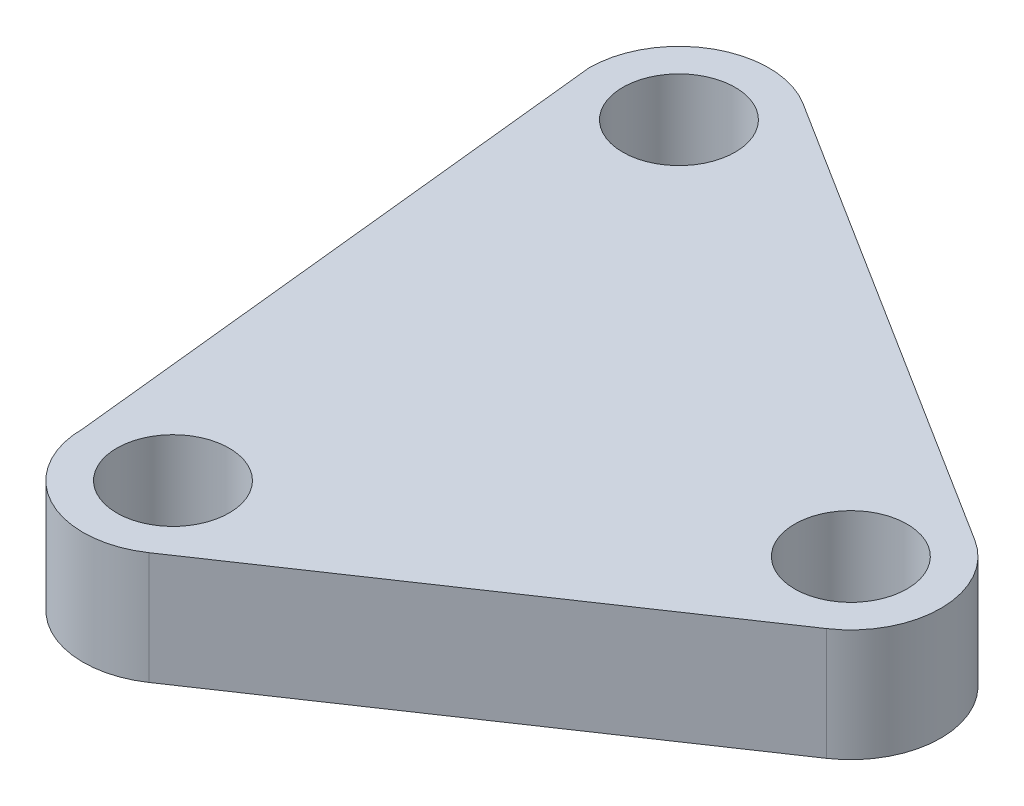
ISO-10303-21;
HEADER;
FILE_DESCRIPTION(('STEP AP214'),'2;1');
FILE_NAME('part.step','',(''),(''),'','','');
FILE_SCHEMA(('AUTOMOTIVE_DESIGN { 1 0 10303 214 1 1 1 1 }'));
ENDSEC;
DATA;
#1=APPLICATION_CONTEXT('core data for automotive mechanical design processes');
#2=APPLICATION_PROTOCOL_DEFINITION('international standard','automotive_design',2000,#1);
#3=PRODUCT_CONTEXT('',#1,'mechanical');
#4=PRODUCT('Part','Part','',(#3));
#5=PRODUCT_RELATED_PRODUCT_CATEGORY('part','',(#4));
#6=PRODUCT_DEFINITION_FORMATION('','',#4);
#7=PRODUCT_DEFINITION_CONTEXT('part definition',#1,'design');
#8=PRODUCT_DEFINITION('design','',#6,#7);
#9=PRODUCT_DEFINITION_SHAPE('','',#8);
#10=(LENGTH_UNIT() NAMED_UNIT(*) SI_UNIT(.MILLI.,.METRE.));
#11=(NAMED_UNIT(*) PLANE_ANGLE_UNIT() SI_UNIT($,.RADIAN.));
#12=(NAMED_UNIT(*) SI_UNIT($,.STERADIAN.) SOLID_ANGLE_UNIT());
#13=UNCERTAINTY_MEASURE_WITH_UNIT(LENGTH_MEASURE(1.E-05),#10,'distance_accuracy_value','');
#14=(GEOMETRIC_REPRESENTATION_CONTEXT(3) GLOBAL_UNCERTAINTY_ASSIGNED_CONTEXT((#13)) GLOBAL_UNIT_ASSIGNED_CONTEXT((#10,
#11,#12)) REPRESENTATION_CONTEXT('',''));
#15=CARTESIAN_POINT('',(0.,0.,0.));
#16=DIRECTION('',(0.,0.,1.));
#17=DIRECTION('',(1.,0.,0.));
#18=AXIS2_PLACEMENT_3D('',#15,#16,#17);
#19=CARTESIAN_POINT('',(14.7285274225901,5.,21.8200406260849));
#20=DIRECTION('',(0.559472855000614,0.,0.828848674075951));
#21=DIRECTION('',(0.828848674075951,0.,-0.559472855000614));
#22=AXIS2_PLACEMENT_3D('',#19,#20,#21);
#23=PLANE('',#22);
#24=DIRECTION('',(-0.828848674075951,0.,0.559472855000614));
#25=VECTOR('',#24,1.);
#26=CARTESIAN_POINT('',(14.7285274225901,0.,21.8200406260849));
#27=LINE('',#26,#25);
#28=CARTESIAN_POINT('',(22.8835584296746,0.,16.3153946963093));
#29=VERTEX_POINT('',#28);
#30=CARTESIAN_POINT('',(4.88355842966658,0.,28.4653946963005));
#31=VERTEX_POINT('',#30);
#32=EDGE_CURVE('E131',#29,#31,#27,.T.);
#33=ORIENTED_EDGE('',*,*,#32,.F.);
#34=DIRECTION('',(0.,-1.,0.));
#35=VECTOR('',#34,1.);
#36=CARTESIAN_POINT('',(22.8835584296746,5.,16.3153946963093));
#37=LINE('',#36,#35);
#38=CARTESIAN_POINT('',(22.8835584296746,5.,16.3153946963093));
#39=VERTEX_POINT('',#38);
#40=EDGE_CURVE('E11',#39,#29,#37,.T.);
#41=ORIENTED_EDGE('',*,*,#40,.F.);
#42=DIRECTION('',(-0.828848674075951,0.,0.559472855000614));
#43=VECTOR('',#42,1.);
#44=CARTESIAN_POINT('',(14.7285274225901,5.,21.8200406260849));
#45=LINE('',#44,#43);
#46=CARTESIAN_POINT('',(4.88355842966658,5.,28.4653946963005));
#47=VERTEX_POINT('',#46);
#48=EDGE_CURVE('E153',#39,#47,#45,.T.);
#49=ORIENTED_EDGE('',*,*,#48,.T.);
#50=DIRECTION('',(0.,-1.,0.));
#51=VECTOR('',#50,1.);
#52=CARTESIAN_POINT('',(4.88355842966658,5.,28.4653946963005));
#53=LINE('',#52,#51);
#54=EDGE_CURVE('E86',#47,#31,#53,.T.);
#55=ORIENTED_EDGE('',*,*,#54,.T.);
#56=EDGE_LOOP('',(#33,#41,#49,#55));
#57=FACE_BOUND('',#56,.T.);
#58=ADVANCED_FACE('F41',(#57),#23,.T.);
#59=CARTESIAN_POINT('',(20.6456670096721,5.,13.0000000000055));
#60=DIRECTION('',(0.,-1.,0.));
#61=DIRECTION('',(0.,0.,-1.));
#62=AXIS2_PLACEMENT_3D('',#59,#60,#61);
#63=CYLINDRICAL_SURFACE('',#62,4.);
#64=CARTESIAN_POINT('',(20.6456670096721,0.,13.0000000000055));
#65=DIRECTION('',(0.,1.,0.));
#66=DIRECTION('',(0.,0.,1.));
#67=AXIS2_PLACEMENT_3D('',#64,#65,#66);
#68=CIRCLE('',#67,4.);
#69=CARTESIAN_POINT('',(22.7770229740054,0.,9.61513342164509));
#70=VERTEX_POINT('',#69);
#71=EDGE_CURVE('E134',#29,#70,#68,.T.);
#72=ORIENTED_EDGE('',*,*,#71,.T.);
#73=DIRECTION('',(0.,-1.,0.));
#74=VECTOR('',#73,1.);
#75=CARTESIAN_POINT('',(22.7770229740054,5.,9.61513342164509));
#76=LINE('',#75,#74);
#77=CARTESIAN_POINT('',(22.7770229740054,5.,9.61513342164509));
#78=VERTEX_POINT('',#77);
#79=EDGE_CURVE('E49',#78,#70,#76,.T.);
#80=ORIENTED_EDGE('',*,*,#79,.F.);
#81=CARTESIAN_POINT('',(20.6456670096721,5.,13.0000000000055));
#82=DIRECTION('',(0.,1.,0.));
#83=DIRECTION('',(0.,0.,1.));
#84=AXIS2_PLACEMENT_3D('',#81,#82,#83);
#85=CIRCLE('',#84,4.);
#86=EDGE_CURVE('E169',#39,#78,#85,.T.);
#87=ORIENTED_EDGE('',*,*,#86,.F.);
#88=ORIENTED_EDGE('',*,*,#40,.T.);
#89=EDGE_LOOP('',(#72,#80,#87,#88));
#90=FACE_BOUND('',#89,.T.);
#91=ADVANCED_FACE('F162',(#90),#63,.T.);
#92=CARTESIAN_POINT('',(2.13135596433326,5.,-3.38486657836037));
#93=DIRECTION('',(0.532838991083316,0.,-0.846216644590092));
#94=DIRECTION('',(-0.846216644590092,0.,-0.532838991083316));
#95=AXIS2_PLACEMENT_3D('',#92,#93,#94);
#96=PLANE('',#95);
#97=DIRECTION('',(0.846216644590092,0.,0.532838991083316));
#98=VECTOR('',#97,1.);
#99=CARTESIAN_POINT('',(2.13135596433326,0.,-3.38486657836037));
#100=LINE('',#99,#98);
#101=CARTESIAN_POINT('',(2.13135596433326,0.,-3.38486657836037));
#102=VERTEX_POINT('',#101);
#103=EDGE_CURVE('E137',#102,#70,#100,.T.);
#104=ORIENTED_EDGE('',*,*,#103,.F.);
#105=DIRECTION('',(0.,-1.,0.));
#106=VECTOR('',#105,1.);
#107=CARTESIAN_POINT('',(2.13135596433326,5.,-3.38486657836037));
#108=LINE('',#107,#106);
#109=CARTESIAN_POINT('',(2.13135596433326,5.,-3.38486657836037));
#110=VERTEX_POINT('',#109);
#111=EDGE_CURVE('E114',#110,#102,#108,.T.);
#112=ORIENTED_EDGE('',*,*,#111,.F.);
#113=DIRECTION('',(0.846216644590092,0.,0.532838991083316));
#114=VECTOR('',#113,1.);
#115=CARTESIAN_POINT('',(2.13135596433326,5.,-3.38486657836037));
#116=LINE('',#115,#114);
#117=EDGE_CURVE('E107',#110,#78,#116,.T.);
#118=ORIENTED_EDGE('',*,*,#117,.T.);
#119=ORIENTED_EDGE('',*,*,#79,.T.);
#120=EDGE_LOOP('',(#104,#112,#118,#119));
#121=FACE_BOUND('',#120,.T.);
#122=ADVANCED_FACE('F159',(#121),#96,.T.);
#123=CARTESIAN_POINT('',(0.,5.,0.));
#124=DIRECTION('',(0.,-1.,0.));
#125=DIRECTION('',(0.,0.,-1.));
#126=AXIS2_PLACEMENT_3D('',#123,#124,#125);
#127=CYLINDRICAL_SURFACE('',#126,4.);
#128=CARTESIAN_POINT('',(0.,0.,0.));
#129=DIRECTION('',(0.,1.,0.));
#130=DIRECTION('',(0.,0.,1.));
#131=AXIS2_PLACEMENT_3D('',#128,#129,#130);
#132=CIRCLE('',#131,4.);
#133=CARTESIAN_POINT('',(-4.,0.,0.));
#134=VERTEX_POINT('',#133);
#135=EDGE_CURVE('E113',#102,#134,#132,.T.);
#136=ORIENTED_EDGE('',*,*,#135,.T.);
#137=DIRECTION('',(0.,-1.,0.));
#138=VECTOR('',#137,1.);
#139=CARTESIAN_POINT('',(-4.,5.,0.));
#140=LINE('',#139,#138);
#141=CARTESIAN_POINT('',(-4.,5.,0.));
#142=VERTEX_POINT('',#141);
#143=EDGE_CURVE('E110',#142,#134,#140,.T.);
#144=ORIENTED_EDGE('',*,*,#143,.F.);
#145=CARTESIAN_POINT('',(0.,5.,0.));
#146=DIRECTION('',(0.,1.,0.));
#147=DIRECTION('',(0.,0.,1.));
#148=AXIS2_PLACEMENT_3D('',#145,#146,#147);
#149=CIRCLE('',#148,4.);
#150=EDGE_CURVE('E100',#110,#142,#149,.T.);
#151=ORIENTED_EDGE('',*,*,#150,.F.);
#152=ORIENTED_EDGE('',*,*,#111,.T.);
#153=EDGE_LOOP('',(#136,#144,#151,#152));
#154=FACE_BOUND('',#153,.T.);
#155=ADVANCED_FACE('F111',(#154),#127,.T.);
#156=CARTESIAN_POINT('',(-3.95622009353356,5.,0.416176579897949));
#157=DIRECTION('',(0.994512455117275,0.,-0.104618242274521));
#158=DIRECTION('',(-0.104618242274521,0.,-0.994512455117275));
#159=AXIS2_PLACEMENT_3D('',#156,#157,#158);
#160=PLANE('',#159);
#161=DIRECTION('',(0.104618242274521,0.,0.994512455117275));
#162=VECTOR('',#161,1.);
#163=CARTESIAN_POINT('',(-3.95622009353356,0.,0.416176579897949));
#164=LINE('',#163,#162);
#165=CARTESIAN_POINT('',(-1.35433299033588,0.,25.1499999999967));
#166=VERTEX_POINT('',#165);
#167=EDGE_CURVE('E79',#134,#166,#164,.T.);
#168=ORIENTED_EDGE('',*,*,#167,.T.);
#169=DIRECTION('',(0.,-1.,0.));
#170=VECTOR('',#169,1.);
#171=CARTESIAN_POINT('',(-1.35433299033588,5.,25.1499999999967));
#172=LINE('',#171,#170);
#173=CARTESIAN_POINT('',(-1.35433299033588,5.,25.1499999999967));
#174=VERTEX_POINT('',#173);
#175=EDGE_CURVE('E115',#174,#166,#172,.T.);
#176=ORIENTED_EDGE('',*,*,#175,.F.);
#177=DIRECTION('',(0.104618242274521,0.,0.994512455117275));
#178=VECTOR('',#177,1.);
#179=CARTESIAN_POINT('',(-3.95622009353356,5.,0.416176579897949));
#180=LINE('',#179,#178);
#181=EDGE_CURVE('E105',#142,#174,#180,.T.);
#182=ORIENTED_EDGE('',*,*,#181,.F.);
#183=ORIENTED_EDGE('',*,*,#143,.T.);
#184=EDGE_LOOP('',(#168,#176,#182,#183));
#185=FACE_BOUND('',#184,.T.);
#186=ADVANCED_FACE('F117',(#185),#160,.F.);
#187=CARTESIAN_POINT('',(2.64566700966412,5.,25.1499999999967));
#188=DIRECTION('',(0.,-1.,0.));
#189=DIRECTION('',(0.,0.,-1.));
#190=AXIS2_PLACEMENT_3D('',#187,#188,#189);
#191=CYLINDRICAL_SURFACE('',#190,2.5);
#192=CARTESIAN_POINT('',(2.64566700966412,5.,25.1499999999967));
#193=DIRECTION('',(0.,1.,0.));
#194=DIRECTION('',(0.,0.,1.));
#195=AXIS2_PLACEMENT_3D('',#192,#193,#194);
#196=CIRCLE('',#195,2.5);
#197=CARTESIAN_POINT('',(2.64566700966412,5.,27.6499999999967));
#198=VERTEX_POINT('',#197);
#199=EDGE_CURVE('E125',#198,#198,#196,.T.);
#200=ORIENTED_EDGE('',*,*,#199,.T.);
#201=EDGE_LOOP('',(#200));
#202=FACE_BOUND('',#201,.T.);
#203=CARTESIAN_POINT('',(2.64566700966412,0.,25.1499999999967));
#204=DIRECTION('',(0.,1.,0.));
#205=DIRECTION('',(0.,0.,1.));
#206=AXIS2_PLACEMENT_3D('',#203,#204,#205);
#207=CIRCLE('',#206,2.5);
#208=CARTESIAN_POINT('',(2.64566700966412,0.,27.6499999999967));
#209=VERTEX_POINT('',#208);
#210=EDGE_CURVE('E147',#209,#209,#207,.T.);
#211=ORIENTED_EDGE('',*,*,#210,.F.);
#212=EDGE_LOOP('',(#211));
#213=FACE_BOUND('',#212,.T.);
#214=ADVANCED_FACE('F185',(#202,#213),#191,.F.);
#215=CARTESIAN_POINT('',(20.6456670096721,5.,13.0000000000055));
#216=DIRECTION('',(0.,-1.,0.));
#217=DIRECTION('',(0.,0.,-1.));
#218=AXIS2_PLACEMENT_3D('',#215,#216,#217);
#219=CYLINDRICAL_SURFACE('',#218,2.5);
#220=CARTESIAN_POINT('',(20.6456670096721,5.,13.0000000000055));
#221=DIRECTION('',(0.,1.,0.));
#222=DIRECTION('',(0.,0.,1.));
#223=AXIS2_PLACEMENT_3D('',#220,#221,#222);
#224=CIRCLE('',#223,2.5);
#225=CARTESIAN_POINT('',(20.6456670096721,5.,15.5000000000055));
#226=VERTEX_POINT('',#225);
#227=EDGE_CURVE('E119',#226,#226,#224,.T.);
#228=ORIENTED_EDGE('',*,*,#227,.T.);
#229=EDGE_LOOP('',(#228));
#230=FACE_BOUND('',#229,.T.);
#231=CARTESIAN_POINT('',(20.6456670096721,0.,13.0000000000055));
#232=DIRECTION('',(0.,1.,0.));
#233=DIRECTION('',(0.,0.,1.));
#234=AXIS2_PLACEMENT_3D('',#231,#232,#233);
#235=CIRCLE('',#234,2.5);
#236=CARTESIAN_POINT('',(20.6456670096721,0.,15.5000000000055));
#237=VERTEX_POINT('',#236);
#238=EDGE_CURVE('E144',#237,#237,#235,.T.);
#239=ORIENTED_EDGE('',*,*,#238,.F.);
#240=EDGE_LOOP('',(#239));
#241=FACE_BOUND('',#240,.T.);
#242=ADVANCED_FACE('F189',(#230,#241),#219,.F.);
#243=CARTESIAN_POINT('',(2.64566700966412,5.,25.1499999999967));
#244=DIRECTION('',(0.,-1.,0.));
#245=DIRECTION('',(0.,0.,-1.));
#246=AXIS2_PLACEMENT_3D('',#243,#244,#245);
#247=CYLINDRICAL_SURFACE('',#246,4.);
#248=CARTESIAN_POINT('',(2.64566700966412,0.,25.1499999999967));
#249=DIRECTION('',(0.,1.,0.));
#250=DIRECTION('',(0.,0.,1.));
#251=AXIS2_PLACEMENT_3D('',#248,#249,#250);
#252=CIRCLE('',#251,4.);
#253=EDGE_CURVE('E142',#166,#31,#252,.T.);
#254=ORIENTED_EDGE('',*,*,#253,.T.);
#255=ORIENTED_EDGE('',*,*,#54,.F.);
#256=CARTESIAN_POINT('',(2.64566700966412,5.,25.1499999999967));
#257=DIRECTION('',(0.,1.,0.));
#258=DIRECTION('',(0.,0.,1.));
#259=AXIS2_PLACEMENT_3D('',#256,#257,#258);
#260=CIRCLE('',#259,4.);
#261=EDGE_CURVE('E57',#174,#47,#260,.T.);
#262=ORIENTED_EDGE('',*,*,#261,.F.);
#263=ORIENTED_EDGE('',*,*,#175,.T.);
#264=EDGE_LOOP('',(#254,#255,#262,#263));
#265=FACE_BOUND('',#264,.T.);
#266=ADVANCED_FACE('F168',(#265),#247,.T.);
#267=CARTESIAN_POINT('',(0.,5.,0.));
#268=DIRECTION('',(0.,-1.,0.));
#269=DIRECTION('',(0.,0.,-1.));
#270=AXIS2_PLACEMENT_3D('',#267,#268,#269);
#271=CYLINDRICAL_SURFACE('',#270,2.5);
#272=CARTESIAN_POINT('',(0.,5.,0.));
#273=DIRECTION('',(0.,1.,0.));
#274=DIRECTION('',(0.,0.,1.));
#275=AXIS2_PLACEMENT_3D('',#272,#273,#274);
#276=CIRCLE('',#275,2.5);
#277=CARTESIAN_POINT('',(0.,5.,2.5));
#278=VERTEX_POINT('',#277);
#279=EDGE_CURVE('E128',#278,#278,#276,.T.);
#280=ORIENTED_EDGE('',*,*,#279,.T.);
#281=EDGE_LOOP('',(#280));
#282=FACE_BOUND('',#281,.T.);
#283=CARTESIAN_POINT('',(0.,0.,0.));
#284=DIRECTION('',(0.,1.,0.));
#285=DIRECTION('',(0.,0.,1.));
#286=AXIS2_PLACEMENT_3D('',#283,#284,#285);
#287=CIRCLE('',#286,2.5);
#288=CARTESIAN_POINT('',(0.,0.,2.5));
#289=VERTEX_POINT('',#288);
#290=EDGE_CURVE('E150',#289,#289,#287,.T.);
#291=ORIENTED_EDGE('',*,*,#290,.F.);
#292=EDGE_LOOP('',(#291));
#293=FACE_BOUND('',#292,.T.);
#294=ADVANCED_FACE('F188',(#282,#293),#271,.F.);
#295=CARTESIAN_POINT('',(0.,5.,0.));
#296=DIRECTION('',(0.,1.,0.));
#297=DIRECTION('',(0.,0.,1.));
#298=AXIS2_PLACEMENT_3D('',#295,#296,#297);
#299=PLANE('',#298);
#300=ORIENTED_EDGE('',*,*,#48,.F.);
#301=ORIENTED_EDGE('',*,*,#86,.T.);
#302=ORIENTED_EDGE('',*,*,#117,.F.);
#303=ORIENTED_EDGE('',*,*,#150,.T.);
#304=ORIENTED_EDGE('',*,*,#181,.T.);
#305=ORIENTED_EDGE('',*,*,#261,.T.);
#306=EDGE_LOOP('',(#300,#301,#302,#303,#304,#305));
#307=FACE_BOUND('',#306,.T.);
#308=ORIENTED_EDGE('',*,*,#227,.F.);
#309=EDGE_LOOP('',(#308));
#310=FACE_BOUND('',#309,.T.);
#311=ORIENTED_EDGE('',*,*,#199,.F.);
#312=EDGE_LOOP('',(#311));
#313=FACE_BOUND('',#312,.T.);
#314=ORIENTED_EDGE('',*,*,#279,.F.);
#315=EDGE_LOOP('',(#314));
#316=FACE_BOUND('',#315,.T.);
#317=ADVANCED_FACE('F102',(#307,#310,#313,#316),#299,.T.);
#318=CARTESIAN_POINT('',(0.,0.,0.));
#319=DIRECTION('',(0.,1.,0.));
#320=DIRECTION('',(0.,0.,1.));
#321=AXIS2_PLACEMENT_3D('',#318,#319,#320);
#322=PLANE('',#321);
#323=ORIENTED_EDGE('',*,*,#32,.T.);
#324=ORIENTED_EDGE('',*,*,#253,.F.);
#325=ORIENTED_EDGE('',*,*,#167,.F.);
#326=ORIENTED_EDGE('',*,*,#135,.F.);
#327=ORIENTED_EDGE('',*,*,#103,.T.);
#328=ORIENTED_EDGE('',*,*,#71,.F.);
#329=EDGE_LOOP('',(#323,#324,#325,#326,#327,#328));
#330=FACE_BOUND('',#329,.T.);
#331=ORIENTED_EDGE('',*,*,#238,.T.);
#332=EDGE_LOOP('',(#331));
#333=FACE_BOUND('',#332,.T.);
#334=ORIENTED_EDGE('',*,*,#210,.T.);
#335=EDGE_LOOP('',(#334));
#336=FACE_BOUND('',#335,.T.);
#337=ORIENTED_EDGE('',*,*,#290,.T.);
#338=EDGE_LOOP('',(#337));
#339=FACE_BOUND('',#338,.T.);
#340=ADVANCED_FACE('F164',(#330,#333,#336,#339),#322,.F.);
#341=CLOSED_SHELL('',(#58,#91,#122,#155,#186,#214,#242,#266,#294,#317,#340));
#342=MANIFOLD_SOLID_BREP('B2',#341);
#343=ADVANCED_BREP_SHAPE_REPRESENTATION('',(#18,#342),#14);
#344=SHAPE_DEFINITION_REPRESENTATION(#9,#343);
ENDSEC;
END-ISO-10303-21;
